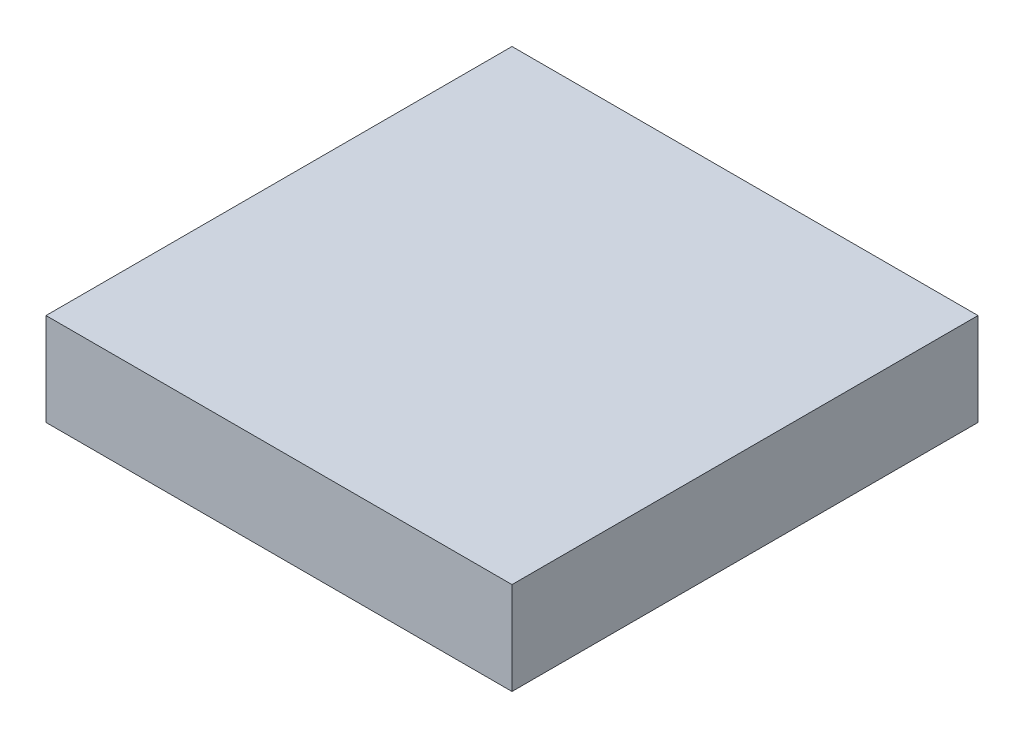
ISO-10303-21;
HEADER;
FILE_DESCRIPTION(('STEP AP214'),'2;1');
FILE_NAME('part.step','',(''),(''),'','','');
FILE_SCHEMA(('AUTOMOTIVE_DESIGN { 1 0 10303 214 1 1 1 1 }'));
ENDSEC;
DATA;
#1=APPLICATION_CONTEXT('core data for automotive mechanical design processes');
#2=APPLICATION_PROTOCOL_DEFINITION('international standard','automotive_design',2000,#1);
#3=PRODUCT_CONTEXT('',#1,'mechanical');
#4=PRODUCT('Part','Part','',(#3));
#5=PRODUCT_RELATED_PRODUCT_CATEGORY('part','',(#4));
#6=PRODUCT_DEFINITION_FORMATION('','',#4);
#7=PRODUCT_DEFINITION_CONTEXT('part definition',#1,'design');
#8=PRODUCT_DEFINITION('design','',#6,#7);
#9=PRODUCT_DEFINITION_SHAPE('','',#8);
#10=(LENGTH_UNIT() NAMED_UNIT(*) SI_UNIT(.MILLI.,.METRE.));
#11=(NAMED_UNIT(*) PLANE_ANGLE_UNIT() SI_UNIT($,.RADIAN.));
#12=(NAMED_UNIT(*) SI_UNIT($,.STERADIAN.) SOLID_ANGLE_UNIT());
#13=UNCERTAINTY_MEASURE_WITH_UNIT(LENGTH_MEASURE(1.E-05),#10,'distance_accuracy_value','');
#14=(GEOMETRIC_REPRESENTATION_CONTEXT(3) GLOBAL_UNCERTAINTY_ASSIGNED_CONTEXT((#13)) GLOBAL_UNIT_ASSIGNED_CONTEXT((#10,
#11,#12)) REPRESENTATION_CONTEXT('',''));
#15=CARTESIAN_POINT('',(0.,0.,0.));
#16=DIRECTION('',(0.,0.,1.));
#17=DIRECTION('',(1.,0.,0.));
#18=AXIS2_PLACEMENT_3D('',#15,#16,#17);
#19=CARTESIAN_POINT('',(7.925,-3.15,-7.925));
#20=DIRECTION('',(1.,0.,0.));
#21=DIRECTION('',(0.,0.,-1.));
#22=AXIS2_PLACEMENT_3D('',#19,#20,#21);
#23=PLANE('',#22);
#24=DIRECTION('',(0.,0.,-1.));
#25=VECTOR('',#24,1.);
#26=CARTESIAN_POINT('',(7.925,0.,-7.925));
#27=LINE('',#26,#25);
#28=CARTESIAN_POINT('',(7.925,0.,7.925));
#29=VERTEX_POINT('',#28);
#30=CARTESIAN_POINT('',(7.925,0.,-7.925));
#31=VERTEX_POINT('',#30);
#32=EDGE_CURVE('E117',#29,#31,#27,.T.);
#33=ORIENTED_EDGE('',*,*,#32,.F.);
#34=DIRECTION('',(0.,1.,0.));
#35=VECTOR('',#34,1.);
#36=CARTESIAN_POINT('',(7.925,-3.15,7.925));
#37=LINE('',#36,#35);
#38=CARTESIAN_POINT('',(7.925,-3.15,7.925));
#39=VERTEX_POINT('',#38);
#40=EDGE_CURVE('E42',#39,#29,#37,.T.);
#41=ORIENTED_EDGE('',*,*,#40,.F.);
#42=DIRECTION('',(0.,0.,-1.));
#43=VECTOR('',#42,1.);
#44=CARTESIAN_POINT('',(7.925,-3.15,-7.925));
#45=LINE('',#44,#43);
#46=CARTESIAN_POINT('',(7.925,-3.15,-7.925));
#47=VERTEX_POINT('',#46);
#48=EDGE_CURVE('E149',#39,#47,#45,.T.);
#49=ORIENTED_EDGE('',*,*,#48,.T.);
#50=DIRECTION('',(0.,1.,0.));
#51=VECTOR('',#50,1.);
#52=CARTESIAN_POINT('',(7.925,-3.15,-7.925));
#53=LINE('',#52,#51);
#54=EDGE_CURVE('E83',#47,#31,#53,.T.);
#55=ORIENTED_EDGE('',*,*,#54,.T.);
#56=EDGE_LOOP('',(#33,#41,#49,#55));
#57=FACE_BOUND('',#56,.T.);
#58=ADVANCED_FACE('F35',(#57),#23,.T.);
#59=CARTESIAN_POINT('',(-7.925,-3.15,7.925));
#60=DIRECTION('',(0.,0.,1.));
#61=DIRECTION('',(1.,0.,0.));
#62=AXIS2_PLACEMENT_3D('',#59,#60,#61);
#63=PLANE('',#62);
#64=DIRECTION('',(1.,0.,0.));
#65=VECTOR('',#64,1.);
#66=CARTESIAN_POINT('',(-7.925,0.,7.925));
#67=LINE('',#66,#65);
#68=CARTESIAN_POINT('',(-7.925,0.,7.925));
#69=VERTEX_POINT('',#68);
#70=EDGE_CURVE('E152',#69,#29,#67,.T.);
#71=ORIENTED_EDGE('',*,*,#70,.F.);
#72=DIRECTION('',(0.,1.,0.));
#73=VECTOR('',#72,1.);
#74=CARTESIAN_POINT('',(-7.925,-3.15,7.925));
#75=LINE('',#74,#73);
#76=CARTESIAN_POINT('',(-7.925,-3.15,7.925));
#77=VERTEX_POINT('',#76);
#78=EDGE_CURVE('E170',#77,#69,#75,.T.);
#79=ORIENTED_EDGE('',*,*,#78,.F.);
#80=DIRECTION('',(1.,0.,0.));
#81=VECTOR('',#80,1.);
#82=CARTESIAN_POINT('',(-7.925,-3.15,7.925));
#83=LINE('',#82,#81);
#84=EDGE_CURVE('E157',#77,#39,#83,.T.);
#85=ORIENTED_EDGE('',*,*,#84,.T.);
#86=ORIENTED_EDGE('',*,*,#40,.T.);
#87=EDGE_LOOP('',(#71,#79,#85,#86));
#88=FACE_BOUND('',#87,.T.);
#89=ADVANCED_FACE('F177',(#88),#63,.T.);
#90=CARTESIAN_POINT('',(-7.925,-3.15,-7.925));
#91=DIRECTION('',(-1.,0.,0.));
#92=DIRECTION('',(0.,0.,1.));
#93=AXIS2_PLACEMENT_3D('',#90,#91,#92);
#94=PLANE('',#93);
#95=DIRECTION('',(0.,0.,1.));
#96=VECTOR('',#95,1.);
#97=CARTESIAN_POINT('',(-7.925,0.,-7.925));
#98=LINE('',#97,#96);
#99=CARTESIAN_POINT('',(-7.925,0.,-7.925));
#100=VERTEX_POINT('',#99);
#101=EDGE_CURVE('E164',#100,#69,#98,.T.);
#102=ORIENTED_EDGE('',*,*,#101,.F.);
#103=DIRECTION('',(0.,1.,0.));
#104=VECTOR('',#103,1.);
#105=CARTESIAN_POINT('',(-7.925,-3.15,-7.925));
#106=LINE('',#105,#104);
#107=CARTESIAN_POINT('',(-7.925,-3.15,-7.925));
#108=VERTEX_POINT('',#107);
#109=EDGE_CURVE('E172',#108,#100,#106,.T.);
#110=ORIENTED_EDGE('',*,*,#109,.F.);
#111=DIRECTION('',(0.,0.,1.));
#112=VECTOR('',#111,1.);
#113=CARTESIAN_POINT('',(-7.925,-3.15,-7.925));
#114=LINE('',#113,#112);
#115=EDGE_CURVE('E154',#108,#77,#114,.T.);
#116=ORIENTED_EDGE('',*,*,#115,.T.);
#117=ORIENTED_EDGE('',*,*,#78,.T.);
#118=EDGE_LOOP('',(#102,#110,#116,#117));
#119=FACE_BOUND('',#118,.T.);
#120=ADVANCED_FACE('F181',(#119),#94,.T.);
#121=CARTESIAN_POINT('',(-7.925,-3.15,-7.925));
#122=DIRECTION('',(0.,0.,-1.));
#123=DIRECTION('',(-1.,0.,0.));
#124=AXIS2_PLACEMENT_3D('',#121,#122,#123);
#125=PLANE('',#124);
#126=DIRECTION('',(-1.,0.,0.));
#127=VECTOR('',#126,1.);
#128=CARTESIAN_POINT('',(-7.925,0.,-7.925));
#129=LINE('',#128,#127);
#130=EDGE_CURVE('E161',#31,#100,#129,.T.);
#131=ORIENTED_EDGE('',*,*,#130,.F.);
#132=ORIENTED_EDGE('',*,*,#54,.F.);
#133=DIRECTION('',(-1.,0.,0.));
#134=VECTOR('',#133,1.);
#135=CARTESIAN_POINT('',(-7.925,-3.15,-7.925));
#136=LINE('',#135,#134);
#137=EDGE_CURVE('E151',#47,#108,#136,.T.);
#138=ORIENTED_EDGE('',*,*,#137,.T.);
#139=ORIENTED_EDGE('',*,*,#109,.T.);
#140=EDGE_LOOP('',(#131,#132,#138,#139));
#141=FACE_BOUND('',#140,.T.);
#142=ADVANCED_FACE('F173',(#141),#125,.T.);
#143=CARTESIAN_POINT('',(0.,-3.15,0.));
#144=DIRECTION('',(0.,1.,0.));
#145=DIRECTION('',(0.,0.,1.));
#146=AXIS2_PLACEMENT_3D('',#143,#144,#145);
#147=PLANE('',#146);
#148=DIRECTION('',(1.,0.,0.));
#149=VECTOR('',#148,1.);
#150=CARTESIAN_POINT('',(0.,-3.15,6.425));
#151=LINE('',#150,#149);
#152=CARTESIAN_POINT('',(-6.425,-3.15,6.425));
#153=VERTEX_POINT('',#152);
#154=CARTESIAN_POINT('',(6.425,-3.15,6.425));
#155=VERTEX_POINT('',#154);
#156=EDGE_CURVE('E144',#153,#155,#151,.T.);
#157=ORIENTED_EDGE('',*,*,#156,.T.);
#158=DIRECTION('',(0.,0.,-1.));
#159=VECTOR('',#158,1.);
#160=CARTESIAN_POINT('',(6.425,-3.15,0.));
#161=LINE('',#160,#159);
#162=CARTESIAN_POINT('',(6.425,-3.15,-6.425));
#163=VERTEX_POINT('',#162);
#164=EDGE_CURVE('E112',#155,#163,#161,.T.);
#165=ORIENTED_EDGE('',*,*,#164,.T.);
#166=DIRECTION('',(-1.,0.,0.));
#167=VECTOR('',#166,1.);
#168=CARTESIAN_POINT('',(0.,-3.15,-6.425));
#169=LINE('',#168,#167);
#170=CARTESIAN_POINT('',(-6.425,-3.15,-6.425));
#171=VERTEX_POINT('',#170);
#172=EDGE_CURVE('E134',#163,#171,#169,.T.);
#173=ORIENTED_EDGE('',*,*,#172,.T.);
#174=DIRECTION('',(0.,0.,1.));
#175=VECTOR('',#174,1.);
#176=CARTESIAN_POINT('',(-6.425,-3.15,0.));
#177=LINE('',#176,#175);
#178=EDGE_CURVE('E49',#171,#153,#177,.T.);
#179=ORIENTED_EDGE('',*,*,#178,.T.);
#180=EDGE_LOOP('',(#157,#165,#173,#179));
#181=FACE_BOUND('',#180,.T.);
#182=ORIENTED_EDGE('',*,*,#48,.F.);
#183=ORIENTED_EDGE('',*,*,#84,.F.);
#184=ORIENTED_EDGE('',*,*,#115,.F.);
#185=ORIENTED_EDGE('',*,*,#137,.F.);
#186=EDGE_LOOP('',(#182,#183,#184,#185));
#187=FACE_BOUND('',#186,.T.);
#188=ADVANCED_FACE('F183',(#181,#187),#147,.F.);
#189=CARTESIAN_POINT('',(0.,0.,0.));
#190=DIRECTION('',(0.,1.,0.));
#191=DIRECTION('',(0.,0.,1.));
#192=AXIS2_PLACEMENT_3D('',#189,#190,#191);
#193=PLANE('',#192);
#194=ORIENTED_EDGE('',*,*,#32,.T.);
#195=ORIENTED_EDGE('',*,*,#130,.T.);
#196=ORIENTED_EDGE('',*,*,#101,.T.);
#197=ORIENTED_EDGE('',*,*,#70,.T.);
#198=EDGE_LOOP('',(#194,#195,#196,#197));
#199=FACE_BOUND('',#198,.T.);
#200=ADVANCED_FACE('F176',(#199),#193,.T.);
#201=CARTESIAN_POINT('',(6.425,-3.15,-7.925));
#202=DIRECTION('',(1.,0.,0.));
#203=DIRECTION('',(0.,0.,-1.));
#204=AXIS2_PLACEMENT_3D('',#201,#202,#203);
#205=PLANE('',#204);
#206=DIRECTION('',(0.,0.,-1.));
#207=VECTOR('',#206,1.);
#208=CARTESIAN_POINT('',(6.425,-1.5,0.));
#209=LINE('',#208,#207);
#210=CARTESIAN_POINT('',(6.425,-1.5,6.425));
#211=VERTEX_POINT('',#210);
#212=CARTESIAN_POINT('',(6.425,-1.5,-6.425));
#213=VERTEX_POINT('',#212);
#214=EDGE_CURVE('E110',#211,#213,#209,.T.);
#215=ORIENTED_EDGE('',*,*,#214,.T.);
#216=DIRECTION('',(0.,1.,0.));
#217=VECTOR('',#216,1.);
#218=CARTESIAN_POINT('',(6.425,-3.15,-6.425));
#219=LINE('',#218,#217);
#220=EDGE_CURVE('E139',#163,#213,#219,.T.);
#221=ORIENTED_EDGE('',*,*,#220,.F.);
#222=ORIENTED_EDGE('',*,*,#164,.F.);
#223=DIRECTION('',(0.,1.,0.));
#224=VECTOR('',#223,1.);
#225=CARTESIAN_POINT('',(6.425,-3.15,6.425));
#226=LINE('',#225,#224);
#227=EDGE_CURVE('E107',#155,#211,#226,.T.);
#228=ORIENTED_EDGE('',*,*,#227,.T.);
#229=EDGE_LOOP('',(#215,#221,#222,#228));
#230=FACE_BOUND('',#229,.T.);
#231=ADVANCED_FACE('F109',(#230),#205,.F.);
#232=CARTESIAN_POINT('',(-7.925,-3.15,6.425));
#233=DIRECTION('',(0.,0.,1.));
#234=DIRECTION('',(1.,0.,0.));
#235=AXIS2_PLACEMENT_3D('',#232,#233,#234);
#236=PLANE('',#235);
#237=DIRECTION('',(1.,0.,0.));
#238=VECTOR('',#237,1.);
#239=CARTESIAN_POINT('',(0.,-1.5,6.425));
#240=LINE('',#239,#238);
#241=CARTESIAN_POINT('',(-6.425,-1.5,6.425));
#242=VERTEX_POINT('',#241);
#243=EDGE_CURVE('E125',#242,#211,#240,.T.);
#244=ORIENTED_EDGE('',*,*,#243,.T.);
#245=ORIENTED_EDGE('',*,*,#227,.F.);
#246=ORIENTED_EDGE('',*,*,#156,.F.);
#247=DIRECTION('',(0.,1.,0.));
#248=VECTOR('',#247,1.);
#249=CARTESIAN_POINT('',(-6.425,-3.15,6.425));
#250=LINE('',#249,#248);
#251=EDGE_CURVE('E118',#153,#242,#250,.T.);
#252=ORIENTED_EDGE('',*,*,#251,.T.);
#253=EDGE_LOOP('',(#244,#245,#246,#252));
#254=FACE_BOUND('',#253,.T.);
#255=ADVANCED_FACE('F130',(#254),#236,.F.);
#256=CARTESIAN_POINT('',(-6.425,-3.15,-7.925));
#257=DIRECTION('',(-1.,0.,0.));
#258=DIRECTION('',(0.,0.,1.));
#259=AXIS2_PLACEMENT_3D('',#256,#257,#258);
#260=PLANE('',#259);
#261=DIRECTION('',(0.,0.,1.));
#262=VECTOR('',#261,1.);
#263=CARTESIAN_POINT('',(-6.425,-1.5,0.));
#264=LINE('',#263,#262);
#265=CARTESIAN_POINT('',(-6.425,-1.5,-6.425));
#266=VERTEX_POINT('',#265);
#267=EDGE_CURVE('E132',#266,#242,#264,.T.);
#268=ORIENTED_EDGE('',*,*,#267,.T.);
#269=ORIENTED_EDGE('',*,*,#251,.F.);
#270=ORIENTED_EDGE('',*,*,#178,.F.);
#271=DIRECTION('',(0.,1.,0.));
#272=VECTOR('',#271,1.);
#273=CARTESIAN_POINT('',(-6.425,-3.15,-6.425));
#274=LINE('',#273,#272);
#275=EDGE_CURVE('E140',#171,#266,#274,.T.);
#276=ORIENTED_EDGE('',*,*,#275,.T.);
#277=EDGE_LOOP('',(#268,#269,#270,#276));
#278=FACE_BOUND('',#277,.T.);
#279=ADVANCED_FACE('F235',(#278),#260,.F.);
#280=CARTESIAN_POINT('',(-7.925,-3.15,-6.425));
#281=DIRECTION('',(0.,0.,-1.));
#282=DIRECTION('',(-1.,0.,0.));
#283=AXIS2_PLACEMENT_3D('',#280,#281,#282);
#284=PLANE('',#283);
#285=DIRECTION('',(-1.,0.,0.));
#286=VECTOR('',#285,1.);
#287=CARTESIAN_POINT('',(0.,-1.5,-6.425));
#288=LINE('',#287,#286);
#289=EDGE_CURVE('E127',#213,#266,#288,.T.);
#290=ORIENTED_EDGE('',*,*,#289,.T.);
#291=ORIENTED_EDGE('',*,*,#275,.F.);
#292=ORIENTED_EDGE('',*,*,#172,.F.);
#293=ORIENTED_EDGE('',*,*,#220,.T.);
#294=EDGE_LOOP('',(#290,#291,#292,#293));
#295=FACE_BOUND('',#294,.T.);
#296=ADVANCED_FACE('F244',(#295),#284,.F.);
#297=CARTESIAN_POINT('',(0.,-1.5,0.));
#298=DIRECTION('',(0.,1.,0.));
#299=DIRECTION('',(0.,0.,1.));
#300=AXIS2_PLACEMENT_3D('',#297,#298,#299);
#301=PLANE('',#300);
#302=CARTESIAN_POINT('',(0.,-1.5,0.));
#303=DIRECTION('',(0.,1.,0.));
#304=DIRECTION('',(0.,0.,1.));
#305=AXIS2_PLACEMENT_3D('',#302,#303,#304);
#306=CIRCLE('',#305,3.225);
#307=CARTESIAN_POINT('',(0.,-1.5,3.225));
#308=VERTEX_POINT('',#307);
#309=EDGE_CURVE('E12',#308,#308,#306,.F.);
#310=ORIENTED_EDGE('',*,*,#309,.F.);
#311=EDGE_LOOP('',(#310));
#312=FACE_BOUND('',#311,.T.);
#313=ORIENTED_EDGE('',*,*,#214,.F.);
#314=ORIENTED_EDGE('',*,*,#243,.F.);
#315=ORIENTED_EDGE('',*,*,#267,.F.);
#316=ORIENTED_EDGE('',*,*,#289,.F.);
#317=EDGE_LOOP('',(#313,#314,#315,#316));
#318=FACE_BOUND('',#317,.T.);
#319=ADVANCED_FACE('F123',(#312,#318),#301,.F.);
#320=CARTESIAN_POINT('',(0.,-12.2716774773065,0.));
#321=DIRECTION('',(0.,1.,0.));
#322=DIRECTION('',(0.,0.,1.));
#323=AXIS2_PLACEMENT_3D('',#320,#321,#322);
#324=CYLINDRICAL_SURFACE('',#323,3.225);
#325=CARTESIAN_POINT('',(0.,-2.95,0.));
#326=DIRECTION('',(0.,1.,0.));
#327=DIRECTION('',(0.,0.,1.));
#328=AXIS2_PLACEMENT_3D('',#325,#326,#327);
#329=CIRCLE('',#328,3.225);
#330=CARTESIAN_POINT('',(0.,-2.95,3.225));
#331=VERTEX_POINT('',#330);
#332=EDGE_CURVE('E308',#331,#331,#329,.T.);
#333=ORIENTED_EDGE('',*,*,#332,.T.);
#334=EDGE_LOOP('',(#333));
#335=FACE_BOUND('',#334,.T.);
#336=ORIENTED_EDGE('',*,*,#309,.T.);
#337=EDGE_LOOP('',(#336));
#338=FACE_BOUND('',#337,.T.);
#339=ADVANCED_FACE('F262',(#335,#338),#324,.T.);
#340=CARTESIAN_POINT('',(0.,-12.2716774773065,0.));
#341=DIRECTION('',(0.,1.,0.));
#342=DIRECTION('',(0.,0.,1.));
#343=AXIS2_PLACEMENT_3D('',#340,#341,#342);
#344=CYLINDRICAL_SURFACE('',#343,2.425);
#345=CARTESIAN_POINT('',(0.,-2.95,0.));
#346=DIRECTION('',(0.,1.,0.));
#347=DIRECTION('',(0.,0.,1.));
#348=AXIS2_PLACEMENT_3D('',#345,#346,#347);
#349=CIRCLE('',#348,2.425);
#350=CARTESIAN_POINT('',(0.,-2.95,2.425));
#351=VERTEX_POINT('',#350);
#352=EDGE_CURVE('E128',#351,#351,#349,.T.);
#353=ORIENTED_EDGE('',*,*,#352,.F.);
#354=EDGE_LOOP('',(#353));
#355=FACE_BOUND('',#354,.T.);
#356=CARTESIAN_POINT('',(0.,-1.5,0.));
#357=DIRECTION('',(0.,-1.,0.));
#358=DIRECTION('',(0.,0.,-1.));
#359=AXIS2_PLACEMENT_3D('',#356,#357,#358);
#360=CIRCLE('',#359,2.425);
#361=CARTESIAN_POINT('',(0.,-1.5,-2.425));
#362=VERTEX_POINT('',#361);
#363=EDGE_CURVE('E306',#362,#362,#360,.T.);
#364=ORIENTED_EDGE('',*,*,#363,.F.);
#365=EDGE_LOOP('',(#364));
#366=FACE_BOUND('',#365,.T.);
#367=ADVANCED_FACE('F273',(#355,#366),#344,.F.);
#368=CARTESIAN_POINT('',(0.,-2.95,0.));
#369=DIRECTION('',(0.,1.,0.));
#370=DIRECTION('',(0.,0.,1.));
#371=AXIS2_PLACEMENT_3D('',#368,#369,#370);
#372=PLANE('',#371);
#373=ORIENTED_EDGE('',*,*,#352,.T.);
#374=EDGE_LOOP('',(#373));
#375=FACE_BOUND('',#374,.T.);
#376=ORIENTED_EDGE('',*,*,#332,.F.);
#377=EDGE_LOOP('',(#376));
#378=FACE_BOUND('',#377,.T.);
#379=ADVANCED_FACE('F283',(#375,#378),#372,.F.);
#380=ORIENTED_EDGE('',*,*,#363,.T.);
#381=EDGE_LOOP('',(#380));
#382=FACE_BOUND('',#381,.T.);
#383=ADVANCED_FACE('F264',(#382),#301,.F.);
#384=CLOSED_SHELL('',(#58,#89,#120,#142,#188,#200,#231,#255,#279,#296,#319,#339,#367,#379,#383));
#385=MANIFOLD_SOLID_BREP('B2',#384);
#386=ADVANCED_BREP_SHAPE_REPRESENTATION('',(#18,#385),#14);
#387=SHAPE_DEFINITION_REPRESENTATION(#9,#386);
ENDSEC;
END-ISO-10303-21;
